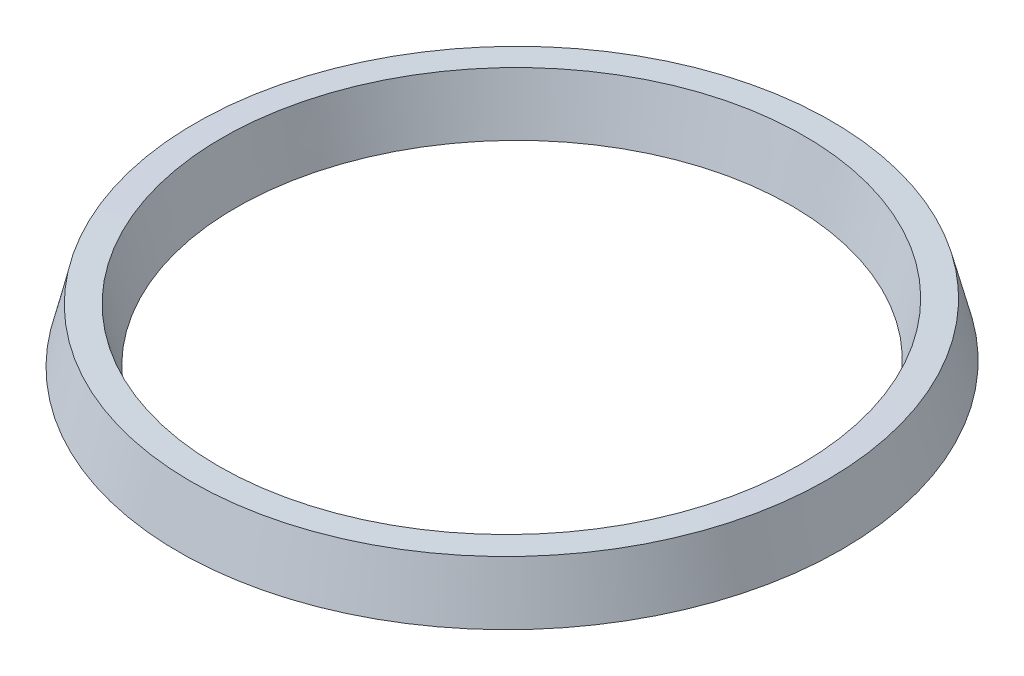
ISO-10303-21;
HEADER;
FILE_DESCRIPTION(('STEP AP214'),'2;1');
FILE_NAME('part.step','',(''),(''),'','','');
FILE_SCHEMA(('AUTOMOTIVE_DESIGN { 1 0 10303 214 1 1 1 1 }'));
ENDSEC;
DATA;
#1=APPLICATION_CONTEXT('core data for automotive mechanical design processes');
#2=APPLICATION_PROTOCOL_DEFINITION('international standard','automotive_design',2000,#1);
#3=PRODUCT_CONTEXT('',#1,'mechanical');
#4=PRODUCT('Part','Part','',(#3));
#5=PRODUCT_RELATED_PRODUCT_CATEGORY('part','',(#4));
#6=PRODUCT_DEFINITION_FORMATION('','',#4);
#7=PRODUCT_DEFINITION_CONTEXT('part definition',#1,'design');
#8=PRODUCT_DEFINITION('design','',#6,#7);
#9=PRODUCT_DEFINITION_SHAPE('','',#8);
#10=(LENGTH_UNIT() NAMED_UNIT(*) SI_UNIT(.MILLI.,.METRE.));
#11=(NAMED_UNIT(*) PLANE_ANGLE_UNIT() SI_UNIT($,.RADIAN.));
#12=(NAMED_UNIT(*) SI_UNIT($,.STERADIAN.) SOLID_ANGLE_UNIT());
#13=UNCERTAINTY_MEASURE_WITH_UNIT(LENGTH_MEASURE(1.E-05),#10,'distance_accuracy_value','');
#14=(GEOMETRIC_REPRESENTATION_CONTEXT(3) GLOBAL_UNCERTAINTY_ASSIGNED_CONTEXT((#13)) GLOBAL_UNIT_ASSIGNED_CONTEXT((#10,
#11,#12)) REPRESENTATION_CONTEXT('',''));
#15=CARTESIAN_POINT('',(0.,0.,0.));
#16=DIRECTION('',(0.,0.,1.));
#17=DIRECTION('',(1.,0.,0.));
#18=AXIS2_PLACEMENT_3D('',#15,#16,#17);
#19=CARTESIAN_POINT('',(-67.8393142200557,5.22932669310561,5.55111512312578E-13));
#20=DIRECTION('',(-0.0118850559060457,0.999929370228773,0.));
#21=DIRECTION('',(-0.999929370228772,-0.0118850559060459,0.));
#22=AXIS2_PLACEMENT_3D('',#19,#20,#21);
#23=CONICAL_SURFACE('',#22,64.8438941294638,0.245949196655473);
#24=CARTESIAN_POINT('',(-67.6971077813169,-6.73497501945119,4.44089209850063E-13));
#25=DIRECTION('',(0.0118850559060457,-0.999929370228773,0.));
#26=DIRECTION('',(0.999929370228772,0.0118850559060459,0.));
#27=AXIS2_PLACEMENT_3D('',#24,#25,#26);
#28=CIRCLE('',#27,61.8402660669669);
#29=CARTESIAN_POINT('',(-5.86120947819499,-6.00000000000054,4.6468615602101E-13));
#30=VERTEX_POINT('',#29);
#31=EDGE_CURVE('E79',#30,#30,#28,.T.);
#32=ORIENTED_EDGE('',*,*,#31,.T.);
#33=EDGE_LOOP('',(#32));
#34=FACE_BOUND('',#33,.T.);
#35=CARTESIAN_POINT('',(-67.8393142200557,5.22932669310561,5.55111512312578E-13));
#36=DIRECTION('',(0.0118850559060457,-0.999929370228773,0.));
#37=DIRECTION('',(0.999929370228772,0.0118850559060459,0.));
#38=AXIS2_PLACEMENT_3D('',#35,#36,#37);
#39=CIRCLE('',#38,64.8438941294639);
#40=CARTESIAN_POINT('',(-2.99999999999977,6.,5.76708867593244E-13));
#41=VERTEX_POINT('',#40);
#42=EDGE_CURVE('E12',#41,#41,#39,.T.);
#43=ORIENTED_EDGE('',*,*,#42,.F.);
#44=EDGE_LOOP('',(#43));
#45=FACE_BOUND('',#44,.T.);
#46=ADVANCED_FACE('F42',(#34,#45),#23,.F.);
#47=CARTESIAN_POINT('',(-67.8384666927319,5.15802139430166,-4.44089209850063E-13));
#48=DIRECTION('',(0.0118850559060457,-0.999929370228773,0.));
#49=DIRECTION('',(0.999929370228772,0.0118850559060459,0.));
#50=AXIS2_PLACEMENT_3D('',#47,#48,#49);
#51=CONICAL_SURFACE('',#50,70.8434703508365,1.55891099106802);
#52=ORIENTED_EDGE('',*,*,#42,.T.);
#53=EDGE_LOOP('',(#52));
#54=FACE_BOUND('',#53,.T.);
#55=CARTESIAN_POINT('',(-67.8384666927319,5.15802139430166,-4.44089209850063E-13));
#56=DIRECTION('',(0.0118850559060457,-0.999929370228773,0.));
#57=DIRECTION('',(0.999929370228772,0.0118850559060459,0.));
#58=AXIS2_PLACEMENT_3D('',#55,#56,#57);
#59=CIRCLE('',#58,70.8434703508365);
#60=CARTESIAN_POINT('',(3.00000000000077,5.99999999999965,-4.20493594271708E-13));
#61=VERTEX_POINT('',#60);
#62=EDGE_CURVE('E49',#61,#61,#59,.T.);
#63=ORIENTED_EDGE('',*,*,#62,.F.);
#64=EDGE_LOOP('',(#63));
#65=FACE_BOUND('',#64,.T.);
#66=ADVANCED_FACE('F99',(#54,#65),#51,.T.);
#67=CARTESIAN_POINT('',(-67.6954127266709,-6.87758561705842,2.22044604925031E-13));
#68=DIRECTION('',(0.0118850559060457,-0.999929370228773,0.));
#69=DIRECTION('',(0.999929370228772,0.0118850559060459,0.));
#70=AXIS2_PLACEMENT_3D('',#67,#68,#69);
#71=CONICAL_SURFACE('',#70,73.8394185097121,0.243948888785414);
#72=ORIENTED_EDGE('',*,*,#62,.T.);
#73=EDGE_LOOP('',(#72));
#74=FACE_BOUND('',#73,.T.);
#75=CARTESIAN_POINT('',(-67.6954127266709,-6.87758561705842,2.22044604925031E-13));
#76=DIRECTION('',(0.0118850559060457,-0.999929370228773,0.));
#77=DIRECTION('',(0.999929370228772,0.0118850559060459,0.));
#78=AXIS2_PLACEMENT_3D('',#75,#76,#77);
#79=CIRCLE('',#78,73.8394185097121);
#80=CARTESIAN_POINT('',(6.1387905218043,-6.00000000000058,2.46638071691356E-13));
#81=VERTEX_POINT('',#80);
#82=EDGE_CURVE('E55',#81,#81,#79,.T.);
#83=ORIENTED_EDGE('',*,*,#82,.F.);
#84=EDGE_LOOP('',(#83));
#85=FACE_BOUND('',#84,.T.);
#86=ADVANCED_FACE('F103',(#74,#85),#71,.T.);
#87=CARTESIAN_POINT('',(-67.6958364903306,-6.84193296765656,6.66133814775094E-13));
#88=DIRECTION('',(0.0118850559060457,-0.999929370228773,0.));
#89=DIRECTION('',(0.999929370228772,0.0118850559060459,0.));
#90=AXIS2_PLACEMENT_3D('',#87,#88,#89);
#91=CONICAL_SURFACE('',#90,70.8396303990258,1.55891099106802);
#92=ORIENTED_EDGE('',*,*,#82,.T.);
#93=EDGE_LOOP('',(#92));
#94=FACE_BOUND('',#93,.T.);
#95=CARTESIAN_POINT('',(-67.6958364903306,-6.84193296765656,6.66133814775094E-13));
#96=DIRECTION('',(0.0118850559060457,-0.999929370228773,0.));
#97=DIRECTION('',(0.999929370228772,0.0118850559060459,0.));
#98=AXIS2_PLACEMENT_3D('',#95,#96,#97);
#99=CIRCLE('',#98,70.8396303990258);
#100=CARTESIAN_POINT('',(3.13879052180624,-6.00000000000051,6.89728151392574E-13));
#101=VERTEX_POINT('',#100);
#102=EDGE_CURVE('E61',#101,#101,#99,.T.);
#103=ORIENTED_EDGE('',*,*,#102,.F.);
#104=EDGE_LOOP('',(#103));
#105=FACE_BOUND('',#104,.T.);
#106=ADVANCED_FACE('F107',(#94,#105),#91,.F.);
#107=CARTESIAN_POINT('',(-67.7525151929885,-2.07336478409914,-2.22044604925031E-13));
#108=DIRECTION('',(0.0118850559060457,-0.999929370228773,0.));
#109=DIRECTION('',(0.999929370228772,0.0118850559060459,0.));
#110=AXIS2_PLACEMENT_3D('',#107,#108,#109);
#111=CONICAL_SURFACE('',#110,69.6526206323794,0.243948888785414);
#112=ORIENTED_EDGE('',*,*,#102,.T.);
#113=EDGE_LOOP('',(#112));
#114=FACE_BOUND('',#113,.T.);
#115=CARTESIAN_POINT('',(-67.7525151929885,-2.07336478409914,-2.22044604925031E-13));
#116=DIRECTION('',(0.0118850559060457,-0.999929370228773,0.));
#117=DIRECTION('',(0.999929370228772,0.0118850559060459,0.));
#118=AXIS2_PLACEMENT_3D('',#115,#116,#117);
#119=CIRCLE('',#118,69.6526206323794);
#120=CARTESIAN_POINT('',(1.89518589073015,-1.24553949388071,-1.98845621979567E-13));
#121=VERTEX_POINT('',#120);
#122=EDGE_CURVE('E67',#121,#121,#119,.T.);
#123=ORIENTED_EDGE('',*,*,#122,.F.);
#124=EDGE_LOOP('',(#123));
#125=FACE_BOUND('',#124,.T.);
#126=ADVANCED_FACE('F113',(#114,#125),#111,.F.);
#127=CARTESIAN_POINT('',(-67.7471410361237,-2.52551051503858,-4.44089209850063E-13));
#128=DIRECTION('',(0.0118850559060457,-0.999929370228773,0.));
#129=DIRECTION('',(0.999929370228772,0.0118850559060459,0.));
#130=AXIS2_PLACEMENT_3D('',#127,#128,#129);
#131=TOROIDAL_SURFACE('',#130,67.8359613194374,1.87208859375513);
#132=ORIENTED_EDGE('',*,*,#122,.T.);
#133=EDGE_LOOP('',(#132));
#134=FACE_BOUND('',#133,.T.);
#135=CARTESIAN_POINT('',(-67.7525583710523,-2.06973206983085,0.));
#136=DIRECTION('',(0.0118850559060457,-0.999929370228773,0.));
#137=DIRECTION('',(0.999929370228772,0.0118850559060459,0.));
#138=AXIS2_PLACEMENT_3D('',#135,#136,#137);
#139=CIRCLE('',#138,66.0202101348766);
#140=CARTESIAN_POINT('',(-1.73701122851391,-1.28507818144895,0.));
#141=VERTEX_POINT('',#140);
#142=EDGE_CURVE('E71',#141,#141,#139,.T.);
#143=ORIENTED_EDGE('',*,*,#142,.F.);
#144=EDGE_LOOP('',(#143));
#145=FACE_BOUND('',#144,.T.);
#146=ADVANCED_FACE('F95',(#134,#145),#131,.F.);
#147=CARTESIAN_POINT('',(-67.6966840176554,-6.77062766885239,2.22044604925031E-13));
#148=DIRECTION('',(-0.0118850559060457,0.999929370228773,0.));
#149=DIRECTION('',(-0.999929370228772,-0.0118850559060459,0.));
#150=AXIS2_PLACEMENT_3D('',#147,#148,#149);
#151=CONICAL_SURFACE('',#150,64.8400541776532,0.245949196655476);
#152=ORIENTED_EDGE('',*,*,#142,.T.);
#153=EDGE_LOOP('',(#152));
#154=FACE_BOUND('',#153,.T.);
#155=CARTESIAN_POINT('',(-67.6966840176554,-6.77062766885239,2.22044604925031E-13));
#156=DIRECTION('',(0.0118850559060457,-0.999929370228773,0.));
#157=DIRECTION('',(0.999929370228772,0.0118850559060459,0.));
#158=AXIS2_PLACEMENT_3D('',#155,#156,#157);
#159=CIRCLE('',#158,64.8400541776532);
#160=CARTESIAN_POINT('',(-2.86120947819518,-5.99999999999994,2.43640681244823E-13));
#161=VERTEX_POINT('',#160);
#162=EDGE_CURVE('E75',#161,#161,#159,.T.);
#163=ORIENTED_EDGE('',*,*,#162,.F.);
#164=EDGE_LOOP('',(#163));
#165=FACE_BOUND('',#164,.T.);
#166=ADVANCED_FACE('F89',(#154,#165),#151,.T.);
#167=CARTESIAN_POINT('',(-67.6971077813169,-6.73497501945119,4.44089209850063E-13));
#168=DIRECTION('',(0.0118850559060457,-0.999929370228773,0.));
#169=DIRECTION('',(0.999929370228772,0.0118850559060459,0.));
#170=AXIS2_PLACEMENT_3D('',#167,#168,#169);
#171=CONICAL_SURFACE('',#170,61.8402660669669,1.55891099106802);
#172=ORIENTED_EDGE('',*,*,#162,.T.);
#173=EDGE_LOOP('',(#172));
#174=FACE_BOUND('',#173,.T.);
#175=ORIENTED_EDGE('',*,*,#31,.F.);
#176=EDGE_LOOP('',(#175));
#177=FACE_BOUND('',#176,.T.);
#178=ADVANCED_FACE('F87',(#174,#177),#171,.F.);
#179=CLOSED_SHELL('',(#46,#66,#86,#106,#126,#146,#166,#178));
#180=MANIFOLD_SOLID_BREP('B2',#179);
#181=ADVANCED_BREP_SHAPE_REPRESENTATION('',(#18,#180),#14);
#182=SHAPE_DEFINITION_REPRESENTATION(#9,#181);
ENDSEC;
END-ISO-10303-21;
